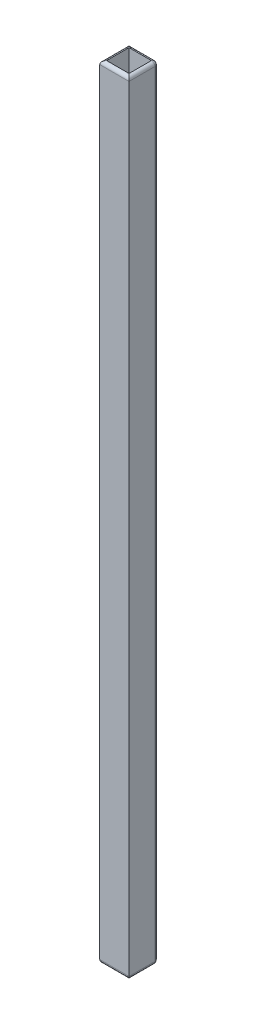
ISO-10303-21;
HEADER;
FILE_DESCRIPTION(('STEP AP214'),'2;1');
FILE_NAME('part.step','',(''),(''),'','','');
FILE_SCHEMA(('AUTOMOTIVE_DESIGN { 1 0 10303 214 1 1 1 1 }'));
ENDSEC;
DATA;
#1=APPLICATION_CONTEXT('core data for automotive mechanical design processes');
#2=APPLICATION_PROTOCOL_DEFINITION('international standard','automotive_design',2000,#1);
#3=PRODUCT_CONTEXT('',#1,'mechanical');
#4=PRODUCT('Part','Part','',(#3));
#5=PRODUCT_RELATED_PRODUCT_CATEGORY('part','',(#4));
#6=PRODUCT_DEFINITION_FORMATION('','',#4);
#7=PRODUCT_DEFINITION_CONTEXT('part definition',#1,'design');
#8=PRODUCT_DEFINITION('design','',#6,#7);
#9=PRODUCT_DEFINITION_SHAPE('','',#8);
#10=(LENGTH_UNIT() NAMED_UNIT(*) SI_UNIT(.MILLI.,.METRE.));
#11=(NAMED_UNIT(*) PLANE_ANGLE_UNIT() SI_UNIT($,.RADIAN.));
#12=(NAMED_UNIT(*) SI_UNIT($,.STERADIAN.) SOLID_ANGLE_UNIT());
#13=UNCERTAINTY_MEASURE_WITH_UNIT(LENGTH_MEASURE(1.E-05),#10,'distance_accuracy_value','');
#14=(GEOMETRIC_REPRESENTATION_CONTEXT(3) GLOBAL_UNCERTAINTY_ASSIGNED_CONTEXT((#13)) GLOBAL_UNIT_ASSIGNED_CONTEXT((#10,
#11,#12)) REPRESENTATION_CONTEXT('',''));
#15=CARTESIAN_POINT('',(0.,0.,0.));
#16=DIRECTION('',(0.,0.,1.));
#17=DIRECTION('',(1.,0.,0.));
#18=AXIS2_PLACEMENT_3D('',#15,#16,#17);
#19=CARTESIAN_POINT('',(-4.24999999999999,113.5,4.25));
#20=DIRECTION('',(-1.,0.,0.));
#21=DIRECTION('',(0.,0.,1.));
#22=AXIS2_PLACEMENT_3D('',#19,#20,#21);
#23=PLANE('',#22);
#24=DIRECTION('',(0.,-1.,0.));
#25=VECTOR('',#24,1.);
#26=CARTESIAN_POINT('',(-4.25,113.5,-4.25));
#27=LINE('',#26,#25);
#28=CARTESIAN_POINT('',(-4.25,112.5,-4.25));
#29=VERTEX_POINT('',#28);
#30=CARTESIAN_POINT('',(-4.25,-112.5,-4.25));
#31=VERTEX_POINT('',#30);
#32=EDGE_CURVE('E156',#29,#31,#27,.T.);
#33=ORIENTED_EDGE('',*,*,#32,.T.);
#34=DIRECTION('',(0.,0.,-1.));
#35=VECTOR('',#34,1.);
#36=CARTESIAN_POINT('',(-4.24999999999999,-112.5,4.25));
#37=LINE('',#36,#35);
#38=CARTESIAN_POINT('',(-4.24999999999999,-112.5,4.25));
#39=VERTEX_POINT('',#38);
#40=EDGE_CURVE('E82',#31,#39,#37,.F.);
#41=ORIENTED_EDGE('',*,*,#40,.T.);
#42=DIRECTION('',(0.,-1.,0.));
#43=VECTOR('',#42,1.);
#44=CARTESIAN_POINT('',(-4.24999999999999,113.5,4.25));
#45=LINE('',#44,#43);
#46=CARTESIAN_POINT('',(-4.24999999999999,112.5,4.25));
#47=VERTEX_POINT('',#46);
#48=EDGE_CURVE('E192',#47,#39,#45,.T.);
#49=ORIENTED_EDGE('',*,*,#48,.F.);
#50=DIRECTION('',(0.,0.,-1.));
#51=VECTOR('',#50,1.);
#52=CARTESIAN_POINT('',(-4.25,112.5,-4.25));
#53=LINE('',#52,#51);
#54=EDGE_CURVE('E200',#47,#29,#53,.T.);
#55=ORIENTED_EDGE('',*,*,#54,.T.);
#56=EDGE_LOOP('',(#33,#41,#49,#55));
#57=FACE_BOUND('',#56,.T.);
#58=ADVANCED_FACE('F59',(#57),#23,.T.);
#59=CARTESIAN_POINT('',(-4.24999999999999,113.5,4.25));
#60=DIRECTION('',(0.,0.,-1.));
#61=DIRECTION('',(-1.,0.,0.));
#62=AXIS2_PLACEMENT_3D('',#59,#60,#61);
#63=PLANE('',#62);
#64=ORIENTED_EDGE('',*,*,#48,.T.);
#65=DIRECTION('',(1.,0.,0.));
#66=VECTOR('',#65,1.);
#67=CARTESIAN_POINT('',(4.24999999999998,-112.5,4.25));
#68=LINE('',#67,#66);
#69=CARTESIAN_POINT('',(4.24999999999998,-112.5,4.25));
#70=VERTEX_POINT('',#69);
#71=EDGE_CURVE('E12',#39,#70,#68,.T.);
#72=ORIENTED_EDGE('',*,*,#71,.T.);
#73=DIRECTION('',(0.,-1.,0.));
#74=VECTOR('',#73,1.);
#75=CARTESIAN_POINT('',(4.24999999999998,113.5,4.25));
#76=LINE('',#75,#74);
#77=CARTESIAN_POINT('',(4.24999999999998,112.5,4.25));
#78=VERTEX_POINT('',#77);
#79=EDGE_CURVE('E195',#78,#70,#76,.T.);
#80=ORIENTED_EDGE('',*,*,#79,.F.);
#81=DIRECTION('',(1.,0.,0.));
#82=VECTOR('',#81,1.);
#83=CARTESIAN_POINT('',(-4.24999999999999,112.5,4.25));
#84=LINE('',#83,#82);
#85=EDGE_CURVE('E163',#78,#47,#84,.F.);
#86=ORIENTED_EDGE('',*,*,#85,.T.);
#87=EDGE_LOOP('',(#64,#72,#80,#86));
#88=FACE_BOUND('',#87,.T.);
#89=ADVANCED_FACE('F269',(#88),#63,.F.);
#90=CARTESIAN_POINT('',(4.24999999999998,113.5,4.25));
#91=DIRECTION('',(-1.,0.,0.));
#92=DIRECTION('',(0.,0.,1.));
#93=AXIS2_PLACEMENT_3D('',#90,#91,#92);
#94=PLANE('',#93);
#95=ORIENTED_EDGE('',*,*,#79,.T.);
#96=DIRECTION('',(0.,0.,-1.));
#97=VECTOR('',#96,1.);
#98=CARTESIAN_POINT('',(4.24999999999998,-112.5,-3.25));
#99=LINE('',#98,#97);
#100=CARTESIAN_POINT('',(4.24999999999998,-112.5,-3.25));
#101=VERTEX_POINT('',#100);
#102=EDGE_CURVE('E68',#70,#101,#99,.T.);
#103=ORIENTED_EDGE('',*,*,#102,.T.);
#104=DIRECTION('',(0.,-1.,0.));
#105=VECTOR('',#104,1.);
#106=CARTESIAN_POINT('',(4.24999999999998,112.5,-3.25));
#107=LINE('',#106,#105);
#108=CARTESIAN_POINT('',(4.24999999999998,112.5,-3.25));
#109=VERTEX_POINT('',#108);
#110=EDGE_CURVE('E215',#101,#109,#107,.F.);
#111=ORIENTED_EDGE('',*,*,#110,.T.);
#112=DIRECTION('',(0.,0.,-1.));
#113=VECTOR('',#112,1.);
#114=CARTESIAN_POINT('',(4.24999999999998,112.5,4.25));
#115=LINE('',#114,#113);
#116=EDGE_CURVE('E202',#109,#78,#115,.F.);
#117=ORIENTED_EDGE('',*,*,#116,.T.);
#118=EDGE_LOOP('',(#95,#103,#111,#117));
#119=FACE_BOUND('',#118,.T.);
#120=ADVANCED_FACE('F271',(#119),#94,.F.);
#121=CARTESIAN_POINT('',(-4.25,113.5,-4.25));
#122=DIRECTION('',(0.,0.,-1.));
#123=DIRECTION('',(-1.,0.,0.));
#124=AXIS2_PLACEMENT_3D('',#121,#122,#123);
#125=PLANE('',#124);
#126=DIRECTION('',(0.,-1.,0.));
#127=VECTOR('',#126,1.);
#128=CARTESIAN_POINT('',(3.24999999999998,-113.5,-4.25));
#129=LINE('',#128,#127);
#130=CARTESIAN_POINT('',(3.24999999999998,112.5,-4.25));
#131=VERTEX_POINT('',#130);
#132=CARTESIAN_POINT('',(3.24999999999998,-112.5,-4.25));
#133=VERTEX_POINT('',#132);
#134=EDGE_CURVE('E212',#131,#133,#129,.T.);
#135=ORIENTED_EDGE('',*,*,#134,.T.);
#136=DIRECTION('',(1.,0.,0.));
#137=VECTOR('',#136,1.);
#138=CARTESIAN_POINT('',(-4.25,-112.5,-4.25));
#139=LINE('',#138,#137);
#140=EDGE_CURVE('E221',#133,#31,#139,.F.);
#141=ORIENTED_EDGE('',*,*,#140,.T.);
#142=ORIENTED_EDGE('',*,*,#32,.F.);
#143=DIRECTION('',(1.,0.,0.));
#144=VECTOR('',#143,1.);
#145=CARTESIAN_POINT('',(4.24999999999998,112.5,-4.25));
#146=LINE('',#145,#144);
#147=EDGE_CURVE('E194',#29,#131,#146,.T.);
#148=ORIENTED_EDGE('',*,*,#147,.T.);
#149=EDGE_LOOP('',(#135,#141,#142,#148));
#150=FACE_BOUND('',#149,.T.);
#151=ADVANCED_FACE('F267',(#150),#125,.T.);
#152=CARTESIAN_POINT('',(0.,113.5,3.25000000000002));
#153=DIRECTION('',(0.,0.,-1.));
#154=DIRECTION('',(-1.,0.,0.));
#155=AXIS2_PLACEMENT_3D('',#152,#153,#154);
#156=PLANE('',#155);
#157=DIRECTION('',(1.,0.,0.));
#158=VECTOR('',#157,1.);
#159=CARTESIAN_POINT('',(0.,-113.5,3.25000000000002));
#160=LINE('',#159,#158);
#161=CARTESIAN_POINT('',(-3.25,-113.5,3.25000000000002));
#162=VERTEX_POINT('',#161);
#163=CARTESIAN_POINT('',(3.25,-113.5,3.25000000000002));
#164=VERTEX_POINT('',#163);
#165=EDGE_CURVE('E180',#162,#164,#160,.T.);
#166=ORIENTED_EDGE('',*,*,#165,.F.);
#167=DIRECTION('',(0.,-1.,0.));
#168=VECTOR('',#167,1.);
#169=CARTESIAN_POINT('',(-3.25,113.5,3.25000000000002));
#170=LINE('',#169,#168);
#171=CARTESIAN_POINT('',(-3.25,113.5,3.25000000000002));
#172=VERTEX_POINT('',#171);
#173=EDGE_CURVE('E139',#172,#162,#170,.T.);
#174=ORIENTED_EDGE('',*,*,#173,.F.);
#175=DIRECTION('',(1.,0.,0.));
#176=VECTOR('',#175,1.);
#177=CARTESIAN_POINT('',(0.,113.5,3.25000000000002));
#178=LINE('',#177,#176);
#179=CARTESIAN_POINT('',(3.25,113.5,3.25000000000002));
#180=VERTEX_POINT('',#179);
#181=EDGE_CURVE('E133',#172,#180,#178,.T.);
#182=ORIENTED_EDGE('',*,*,#181,.T.);
#183=DIRECTION('',(0.,-1.,0.));
#184=VECTOR('',#183,1.);
#185=CARTESIAN_POINT('',(3.25,113.5,3.25000000000002));
#186=LINE('',#185,#184);
#187=EDGE_CURVE('E136',#180,#164,#186,.T.);
#188=ORIENTED_EDGE('',*,*,#187,.T.);
#189=EDGE_LOOP('',(#166,#174,#182,#188));
#190=FACE_BOUND('',#189,.T.);
#191=ADVANCED_FACE('F135',(#190),#156,.T.);
#192=CARTESIAN_POINT('',(3.25,113.5,0.));
#193=DIRECTION('',(-1.,0.,0.));
#194=DIRECTION('',(0.,0.,1.));
#195=AXIS2_PLACEMENT_3D('',#192,#193,#194);
#196=PLANE('',#195);
#197=DIRECTION('',(0.,0.,-1.));
#198=VECTOR('',#197,1.);
#199=CARTESIAN_POINT('',(3.25,-113.5,0.));
#200=LINE('',#199,#198);
#201=CARTESIAN_POINT('',(3.25,-113.5,-3.24999999999999));
#202=VERTEX_POINT('',#201);
#203=EDGE_CURVE('E155',#164,#202,#200,.T.);
#204=ORIENTED_EDGE('',*,*,#203,.F.);
#205=ORIENTED_EDGE('',*,*,#187,.F.);
#206=DIRECTION('',(0.,0.,-1.));
#207=VECTOR('',#206,1.);
#208=CARTESIAN_POINT('',(3.25,113.5,0.));
#209=LINE('',#208,#207);
#210=CARTESIAN_POINT('',(3.25,113.5,-3.24999999999999));
#211=VERTEX_POINT('',#210);
#212=EDGE_CURVE('E145',#180,#211,#209,.T.);
#213=ORIENTED_EDGE('',*,*,#212,.T.);
#214=DIRECTION('',(0.,-1.,0.));
#215=VECTOR('',#214,1.);
#216=CARTESIAN_POINT('',(3.25,113.5,-3.24999999999999));
#217=LINE('',#216,#215);
#218=EDGE_CURVE('E157',#211,#202,#217,.T.);
#219=ORIENTED_EDGE('',*,*,#218,.T.);
#220=EDGE_LOOP('',(#204,#205,#213,#219));
#221=FACE_BOUND('',#220,.T.);
#222=ADVANCED_FACE('F150',(#221),#196,.T.);
#223=CARTESIAN_POINT('',(0.,113.5,-3.24999999999999));
#224=DIRECTION('',(0.,0.,-1.));
#225=DIRECTION('',(-1.,0.,0.));
#226=AXIS2_PLACEMENT_3D('',#223,#224,#225);
#227=PLANE('',#226);
#228=DIRECTION('',(1.,0.,0.));
#229=VECTOR('',#228,1.);
#230=CARTESIAN_POINT('',(0.,-113.5,-3.24999999999999));
#231=LINE('',#230,#229);
#232=CARTESIAN_POINT('',(-3.25,-113.5,-3.24999999999999));
#233=VERTEX_POINT('',#232);
#234=EDGE_CURVE('E183',#233,#202,#231,.T.);
#235=ORIENTED_EDGE('',*,*,#234,.T.);
#236=ORIENTED_EDGE('',*,*,#218,.F.);
#237=DIRECTION('',(1.,0.,0.));
#238=VECTOR('',#237,1.);
#239=CARTESIAN_POINT('',(0.,113.5,-3.24999999999999));
#240=LINE('',#239,#238);
#241=CARTESIAN_POINT('',(-3.25,113.5,-3.24999999999999));
#242=VERTEX_POINT('',#241);
#243=EDGE_CURVE('E172',#242,#211,#240,.T.);
#244=ORIENTED_EDGE('',*,*,#243,.F.);
#245=DIRECTION('',(0.,-1.,0.));
#246=VECTOR('',#245,1.);
#247=CARTESIAN_POINT('',(-3.25,113.5,-3.24999999999999));
#248=LINE('',#247,#246);
#249=EDGE_CURVE('E189',#242,#233,#248,.T.);
#250=ORIENTED_EDGE('',*,*,#249,.T.);
#251=EDGE_LOOP('',(#235,#236,#244,#250));
#252=FACE_BOUND('',#251,.T.);
#253=ADVANCED_FACE('F254',(#252),#227,.F.);
#254=CARTESIAN_POINT('',(-3.25,113.5,0.));
#255=DIRECTION('',(-1.,0.,0.));
#256=DIRECTION('',(0.,0.,1.));
#257=AXIS2_PLACEMENT_3D('',#254,#255,#256);
#258=PLANE('',#257);
#259=DIRECTION('',(0.,0.,-1.));
#260=VECTOR('',#259,1.);
#261=CARTESIAN_POINT('',(-3.25,-113.5,0.));
#262=LINE('',#261,#260);
#263=EDGE_CURVE('E146',#162,#233,#262,.T.);
#264=ORIENTED_EDGE('',*,*,#263,.T.);
#265=ORIENTED_EDGE('',*,*,#249,.F.);
#266=DIRECTION('',(0.,0.,-1.));
#267=VECTOR('',#266,1.);
#268=CARTESIAN_POINT('',(-3.25,113.5,0.));
#269=LINE('',#268,#267);
#270=EDGE_CURVE('E175',#172,#242,#269,.T.);
#271=ORIENTED_EDGE('',*,*,#270,.F.);
#272=ORIENTED_EDGE('',*,*,#173,.T.);
#273=EDGE_LOOP('',(#264,#265,#271,#272));
#274=FACE_BOUND('',#273,.T.);
#275=ADVANCED_FACE('F246',(#274),#258,.F.);
#276=CARTESIAN_POINT('',(0.,112.5,3.25));
#277=DIRECTION('',(1.,0.,0.));
#278=DIRECTION('',(0.,0.,-1.));
#279=AXIS2_PLACEMENT_3D('',#276,#277,#278);
#280=CYLINDRICAL_SURFACE('',#279,1.);
#281=CARTESIAN_POINT('',(3.24999999999998,112.5,3.25));
#282=DIRECTION('',(0.707106781186548,0.,-0.707106781186547));
#283=DIRECTION('',(0.707106781186547,0.,0.707106781186547));
#284=AXIS2_PLACEMENT_3D('',#281,#282,#283);
#285=ELLIPSE('',#284,1.4142135623731,1.);
#286=EDGE_CURVE('E161',#180,#78,#285,.T.);
#287=ORIENTED_EDGE('',*,*,#286,.F.);
#288=ORIENTED_EDGE('',*,*,#181,.F.);
#289=CARTESIAN_POINT('',(-3.24999999999999,112.5,3.25));
#290=DIRECTION('',(0.707106781186548,0.,0.707106781186547));
#291=DIRECTION('',(0.707106781186547,0.,-0.707106781186548));
#292=AXIS2_PLACEMENT_3D('',#289,#290,#291);
#293=ELLIPSE('',#292,1.41421356237309,1.);
#294=EDGE_CURVE('E166',#47,#172,#293,.F.);
#295=ORIENTED_EDGE('',*,*,#294,.F.);
#296=ORIENTED_EDGE('',*,*,#85,.F.);
#297=EDGE_LOOP('',(#287,#288,#295,#296));
#298=FACE_BOUND('',#297,.T.);
#299=ADVANCED_FACE('F162',(#298),#280,.T.);
#300=CARTESIAN_POINT('',(-3.24999999999999,112.5,4.25));
#301=DIRECTION('',(0.,0.,1.));
#302=DIRECTION('',(1.,0.,0.));
#303=AXIS2_PLACEMENT_3D('',#300,#301,#302);
#304=CYLINDRICAL_SURFACE('',#303,1.);
#305=ORIENTED_EDGE('',*,*,#294,.T.);
#306=ORIENTED_EDGE('',*,*,#270,.T.);
#307=CARTESIAN_POINT('',(-3.25,112.5,-3.25));
#308=DIRECTION('',(-0.707106781186547,0.,0.707106781186548));
#309=DIRECTION('',(0.707106781186548,0.,0.707106781186547));
#310=AXIS2_PLACEMENT_3D('',#307,#308,#309);
#311=ELLIPSE('',#310,1.4142135623731,1.);
#312=EDGE_CURVE('E167',#29,#242,#311,.F.);
#313=ORIENTED_EDGE('',*,*,#312,.F.);
#314=ORIENTED_EDGE('',*,*,#54,.F.);
#315=EDGE_LOOP('',(#305,#306,#313,#314));
#316=FACE_BOUND('',#315,.T.);
#317=ADVANCED_FACE('F250',(#316),#304,.T.);
#318=CARTESIAN_POINT('',(3.24999999999998,112.5,0.));
#319=DIRECTION('',(0.,0.,-1.));
#320=DIRECTION('',(-1.,0.,0.));
#321=AXIS2_PLACEMENT_3D('',#318,#319,#320);
#322=CYLINDRICAL_SURFACE('',#321,1.);
#323=ORIENTED_EDGE('',*,*,#116,.F.);
#324=CARTESIAN_POINT('',(3.24999999999998,112.5,-3.25));
#325=DIRECTION('',(0.,0.,-1.));
#326=DIRECTION('',(-1.,0.,0.));
#327=AXIS2_PLACEMENT_3D('',#324,#325,#326);
#328=CIRCLE('',#327,1.);
#329=EDGE_CURVE('E171',#109,#211,#328,.F.);
#330=ORIENTED_EDGE('',*,*,#329,.T.);
#331=ORIENTED_EDGE('',*,*,#212,.F.);
#332=ORIENTED_EDGE('',*,*,#286,.T.);
#333=EDGE_LOOP('',(#323,#330,#331,#332));
#334=FACE_BOUND('',#333,.T.);
#335=ADVANCED_FACE('F169',(#334),#322,.T.);
#336=CARTESIAN_POINT('',(-4.25,112.5,-3.25));
#337=DIRECTION('',(-1.,0.,0.));
#338=DIRECTION('',(0.,0.,1.));
#339=AXIS2_PLACEMENT_3D('',#336,#337,#338);
#340=CYLINDRICAL_SURFACE('',#339,1.);
#341=ORIENTED_EDGE('',*,*,#243,.T.);
#342=CARTESIAN_POINT('',(3.24999999999998,112.5,-3.25));
#343=DIRECTION('',(-1.,0.,0.));
#344=DIRECTION('',(0.,0.,1.));
#345=AXIS2_PLACEMENT_3D('',#342,#343,#344);
#346=CIRCLE('',#345,1.);
#347=EDGE_CURVE('E205',#211,#131,#346,.T.);
#348=ORIENTED_EDGE('',*,*,#347,.T.);
#349=ORIENTED_EDGE('',*,*,#147,.F.);
#350=ORIENTED_EDGE('',*,*,#312,.T.);
#351=EDGE_LOOP('',(#341,#348,#349,#350));
#352=FACE_BOUND('',#351,.T.);
#353=ADVANCED_FACE('F257',(#352),#340,.T.);
#354=CARTESIAN_POINT('',(3.24999999999998,113.5,-3.25));
#355=DIRECTION('',(0.,1.,0.));
#356=DIRECTION('',(0.,0.,1.));
#357=AXIS2_PLACEMENT_3D('',#354,#355,#356);
#358=CYLINDRICAL_SURFACE('',#357,1.);
#359=ORIENTED_EDGE('',*,*,#110,.F.);
#360=CARTESIAN_POINT('',(3.24999999999998,-112.5,-3.25));
#361=DIRECTION('',(0.,1.,0.));
#362=DIRECTION('',(0.,0.,1.));
#363=AXIS2_PLACEMENT_3D('',#360,#361,#362);
#364=CIRCLE('',#363,1.);
#365=EDGE_CURVE('E217',#101,#133,#364,.T.);
#366=ORIENTED_EDGE('',*,*,#365,.T.);
#367=ORIENTED_EDGE('',*,*,#134,.F.);
#368=CARTESIAN_POINT('',(3.24999999999998,112.5,-3.25));
#369=DIRECTION('',(0.,1.,0.));
#370=DIRECTION('',(0.,0.,1.));
#371=AXIS2_PLACEMENT_3D('',#368,#369,#370);
#372=CIRCLE('',#371,1.);
#373=EDGE_CURVE('E206',#109,#131,#372,.T.);
#374=ORIENTED_EDGE('',*,*,#373,.F.);
#375=EDGE_LOOP('',(#359,#366,#367,#374));
#376=FACE_BOUND('',#375,.T.);
#377=ADVANCED_FACE('F264',(#376),#358,.T.);
#378=CARTESIAN_POINT('',(3.24999999999998,112.5,-3.25));
#379=DIRECTION('',(0.,0.,1.));
#380=DIRECTION('',(1.,0.,0.));
#381=AXIS2_PLACEMENT_3D('',#378,#379,#380);
#382=SPHERICAL_SURFACE('',#381,1.);
#383=ORIENTED_EDGE('',*,*,#347,.F.);
#384=ORIENTED_EDGE('',*,*,#329,.F.);
#385=ORIENTED_EDGE('',*,*,#373,.T.);
#386=EDGE_LOOP('',(#383,#384,#385));
#387=FACE_BOUND('',#386,.T.);
#388=ADVANCED_FACE('F259',(#387),#382,.T.);
#389=CARTESIAN_POINT('',(-3.25,-112.5,0.));
#390=DIRECTION('',(0.,0.,-1.));
#391=DIRECTION('',(-1.,0.,0.));
#392=AXIS2_PLACEMENT_3D('',#389,#390,#391);
#393=CYLINDRICAL_SURFACE('',#392,1.);
#394=CARTESIAN_POINT('',(-3.25,-112.5,-3.25));
#395=DIRECTION('',(0.707106781186547,0.,-0.707106781186548));
#396=DIRECTION('',(-0.707106781186548,0.,-0.707106781186547));
#397=AXIS2_PLACEMENT_3D('',#394,#395,#396);
#398=ELLIPSE('',#397,1.4142135623731,1.);
#399=EDGE_CURVE('E231',#233,#31,#398,.T.);
#400=ORIENTED_EDGE('',*,*,#399,.F.);
#401=ORIENTED_EDGE('',*,*,#263,.F.);
#402=CARTESIAN_POINT('',(-3.24999999999999,-112.5,3.25));
#403=DIRECTION('',(-0.707106781186548,0.,-0.707106781186547));
#404=DIRECTION('',(-0.707106781186547,0.,0.707106781186548));
#405=AXIS2_PLACEMENT_3D('',#402,#403,#404);
#406=ELLIPSE('',#405,1.41421356237309,1.);
#407=EDGE_CURVE('E63',#39,#162,#406,.F.);
#408=ORIENTED_EDGE('',*,*,#407,.F.);
#409=ORIENTED_EDGE('',*,*,#40,.F.);
#410=EDGE_LOOP('',(#400,#401,#408,#409));
#411=FACE_BOUND('',#410,.T.);
#412=ADVANCED_FACE('F61',(#411),#393,.T.);
#413=CARTESIAN_POINT('',(-4.24999999999999,-112.5,3.25));
#414=DIRECTION('',(-1.,0.,0.));
#415=DIRECTION('',(0.,0.,1.));
#416=AXIS2_PLACEMENT_3D('',#413,#414,#415);
#417=CYLINDRICAL_SURFACE('',#416,1.);
#418=ORIENTED_EDGE('',*,*,#407,.T.);
#419=ORIENTED_EDGE('',*,*,#165,.T.);
#420=CARTESIAN_POINT('',(3.24999999999998,-112.5,3.25));
#421=DIRECTION('',(-0.707106781186548,0.,0.707106781186547));
#422=DIRECTION('',(-0.707106781186547,0.,-0.707106781186547));
#423=AXIS2_PLACEMENT_3D('',#420,#421,#422);
#424=ELLIPSE('',#423,1.4142135623731,1.);
#425=EDGE_CURVE('E229',#70,#164,#424,.F.);
#426=ORIENTED_EDGE('',*,*,#425,.F.);
#427=ORIENTED_EDGE('',*,*,#71,.F.);
#428=EDGE_LOOP('',(#418,#419,#426,#427));
#429=FACE_BOUND('',#428,.T.);
#430=ADVANCED_FACE('F240',(#429),#417,.T.);
#431=CARTESIAN_POINT('',(0.,-112.5,-3.25));
#432=DIRECTION('',(1.,0.,0.));
#433=DIRECTION('',(0.,0.,-1.));
#434=AXIS2_PLACEMENT_3D('',#431,#432,#433);
#435=CYLINDRICAL_SURFACE('',#434,1.);
#436=ORIENTED_EDGE('',*,*,#399,.T.);
#437=ORIENTED_EDGE('',*,*,#140,.F.);
#438=CARTESIAN_POINT('',(3.24999999999998,-112.5,-3.25));
#439=DIRECTION('',(1.,0.,0.));
#440=DIRECTION('',(0.,0.,-1.));
#441=AXIS2_PLACEMENT_3D('',#438,#439,#440);
#442=CIRCLE('',#441,1.);
#443=EDGE_CURVE('E227',#202,#133,#442,.T.);
#444=ORIENTED_EDGE('',*,*,#443,.F.);
#445=ORIENTED_EDGE('',*,*,#234,.F.);
#446=EDGE_LOOP('',(#436,#437,#444,#445));
#447=FACE_BOUND('',#446,.T.);
#448=ADVANCED_FACE('F279',(#447),#435,.T.);
#449=CARTESIAN_POINT('',(3.24999999999998,-112.5,4.25));
#450=DIRECTION('',(0.,0.,1.));
#451=DIRECTION('',(1.,0.,0.));
#452=AXIS2_PLACEMENT_3D('',#449,#450,#451);
#453=CYLINDRICAL_SURFACE('',#452,1.);
#454=ORIENTED_EDGE('',*,*,#425,.T.);
#455=ORIENTED_EDGE('',*,*,#203,.T.);
#456=CARTESIAN_POINT('',(3.24999999999998,-112.5,-3.25));
#457=DIRECTION('',(0.,0.,-1.));
#458=DIRECTION('',(-1.,0.,0.));
#459=AXIS2_PLACEMENT_3D('',#456,#457,#458);
#460=CIRCLE('',#459,1.);
#461=EDGE_CURVE('E225',#101,#202,#460,.T.);
#462=ORIENTED_EDGE('',*,*,#461,.F.);
#463=ORIENTED_EDGE('',*,*,#102,.F.);
#464=EDGE_LOOP('',(#454,#455,#462,#463));
#465=FACE_BOUND('',#464,.T.);
#466=ADVANCED_FACE('F275',(#465),#453,.T.);
#467=CARTESIAN_POINT('',(3.24999999999998,-112.5,-3.25));
#468=DIRECTION('',(0.,-1.,0.));
#469=DIRECTION('',(0.,0.,-1.));
#470=AXIS2_PLACEMENT_3D('',#467,#468,#469);
#471=SPHERICAL_SURFACE('',#470,1.);
#472=ORIENTED_EDGE('',*,*,#443,.T.);
#473=ORIENTED_EDGE('',*,*,#365,.F.);
#474=ORIENTED_EDGE('',*,*,#461,.T.);
#475=EDGE_LOOP('',(#472,#473,#474));
#476=FACE_BOUND('',#475,.T.);
#477=ADVANCED_FACE('F278',(#476),#471,.T.);
#478=CLOSED_SHELL('',(#58,#89,#120,#151,#191,#222,#253,#275,#299,#317,#335,#353,#377,#388,#412,
#430,#448,#466,#477));
#479=MANIFOLD_SOLID_BREP('B2',#478);
#480=ADVANCED_BREP_SHAPE_REPRESENTATION('',(#18,#479),#14);
#481=SHAPE_DEFINITION_REPRESENTATION(#9,#480);
ENDSEC;
END-ISO-10303-21;
